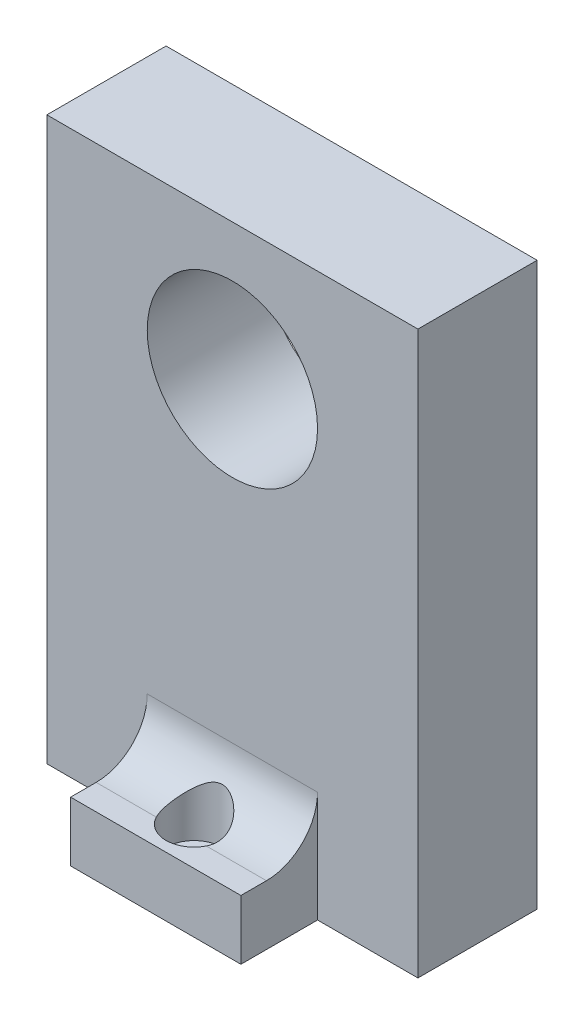
ISO-10303-21;
HEADER;
FILE_DESCRIPTION(('STEP AP214'),'2;1');
FILE_NAME('part.step','',(''),(''),'','','');
FILE_SCHEMA(('AUTOMOTIVE_DESIGN { 1 0 10303 214 1 1 1 1 }'));
ENDSEC;
DATA;
#1=APPLICATION_CONTEXT('core data for automotive mechanical design processes');
#2=APPLICATION_PROTOCOL_DEFINITION('international standard','automotive_design',2000,#1);
#3=PRODUCT_CONTEXT('',#1,'mechanical');
#4=PRODUCT('Part','Part','',(#3));
#5=PRODUCT_RELATED_PRODUCT_CATEGORY('part','',(#4));
#6=PRODUCT_DEFINITION_FORMATION('','',#4);
#7=PRODUCT_DEFINITION_CONTEXT('part definition',#1,'design');
#8=PRODUCT_DEFINITION('design','',#6,#7);
#9=PRODUCT_DEFINITION_SHAPE('','',#8);
#10=(LENGTH_UNIT() NAMED_UNIT(*) SI_UNIT(.MILLI.,.METRE.));
#11=(NAMED_UNIT(*) PLANE_ANGLE_UNIT() SI_UNIT($,.RADIAN.));
#12=(NAMED_UNIT(*) SI_UNIT($,.STERADIAN.) SOLID_ANGLE_UNIT());
#13=UNCERTAINTY_MEASURE_WITH_UNIT(LENGTH_MEASURE(1.E-05),#10,'distance_accuracy_value','');
#14=(GEOMETRIC_REPRESENTATION_CONTEXT(3) GLOBAL_UNCERTAINTY_ASSIGNED_CONTEXT((#13)) GLOBAL_UNIT_ASSIGNED_CONTEXT((#10,
#11,#12)) REPRESENTATION_CONTEXT('',''));
#15=CARTESIAN_POINT('',(0.,0.,0.));
#16=DIRECTION('',(0.,0.,1.));
#17=DIRECTION('',(1.,0.,0.));
#18=AXIS2_PLACEMENT_3D('',#15,#16,#17);
#19=CARTESIAN_POINT('',(10.89386886,0.,-2.25));
#20=DIRECTION('',(0.,1.,0.));
#21=DIRECTION('',(-1.,0.,0.));
#22=AXIS2_PLACEMENT_3D('',#19,#20,#21);
#23=CYLINDRICAL_SURFACE('',#22,1.);
#24=CARTESIAN_POINT('',(10.89386886,0.,-2.25));
#25=DIRECTION('',(0.,1.,0.));
#26=DIRECTION('',(-1.,0.,0.));
#27=AXIS2_PLACEMENT_3D('',#24,#25,#26);
#28=CIRCLE('',#27,1.);
#29=CARTESIAN_POINT('',(9.89386886,0.,-2.25));
#30=VERTEX_POINT('',#29);
#31=EDGE_CURVE('E177',#30,#30,#28,.T.);
#32=ORIENTED_EDGE('',*,*,#31,.F.);
#33=EDGE_LOOP('',(#32));
#34=FACE_BOUND('',#33,.T.);
#35=CARTESIAN_POINT('',(10.89386886,1.5,-2.25));
#36=DIRECTION('',(0.,1.,0.));
#37=DIRECTION('',(-1.,0.,0.));
#38=AXIS2_PLACEMENT_3D('',#35,#36,#37);
#39=CIRCLE('',#38,1.);
#40=CARTESIAN_POINT('',(9.89386886,1.5,-2.25));
#41=VERTEX_POINT('',#40);
#42=EDGE_CURVE('E251',#41,#41,#39,.F.);
#43=ORIENTED_EDGE('',*,*,#42,.F.);
#44=EDGE_LOOP('',(#43));
#45=FACE_BOUND('',#44,.T.);
#46=ADVANCED_FACE('F33',(#34,#45),#23,.F.);
#47=CARTESIAN_POINT('',(10.89386886,0.,9.25));
#48=DIRECTION('',(0.,1.,0.));
#49=DIRECTION('',(-1.,0.,0.));
#50=AXIS2_PLACEMENT_3D('',#47,#48,#49);
#51=CYLINDRICAL_SURFACE('',#50,1.);
#52=CARTESIAN_POINT('',(10.89386886,0.,9.25));
#53=DIRECTION('',(0.,1.,0.));
#54=DIRECTION('',(-1.,0.,0.));
#55=AXIS2_PLACEMENT_3D('',#52,#53,#54);
#56=CIRCLE('',#55,1.);
#57=CARTESIAN_POINT('',(9.89386886,0.,9.25));
#58=VERTEX_POINT('',#57);
#59=EDGE_CURVE('E255',#58,#58,#56,.T.);
#60=ORIENTED_EDGE('',*,*,#59,.F.);
#61=EDGE_LOOP('',(#60));
#62=FACE_BOUND('',#61,.T.);
#63=CARTESIAN_POINT('',(10.89386886,1.5,9.25));
#64=DIRECTION('',(0.,1.,0.));
#65=DIRECTION('',(-1.,0.,0.));
#66=AXIS2_PLACEMENT_3D('',#63,#64,#65);
#67=CIRCLE('',#66,1.);
#68=CARTESIAN_POINT('',(9.89386886,1.5,9.25));
#69=VERTEX_POINT('',#68);
#70=EDGE_CURVE('E248',#69,#69,#67,.F.);
#71=ORIENTED_EDGE('',*,*,#70,.F.);
#72=EDGE_LOOP('',(#71));
#73=FACE_BOUND('',#72,.T.);
#74=ADVANCED_FACE('F309',(#62,#73),#51,.F.);
#75=CARTESIAN_POINT('',(0.,0.,0.));
#76=DIRECTION('',(0.,0.,-1.));
#77=DIRECTION('',(-1.,0.,0.));
#78=AXIS2_PLACEMENT_3D('',#75,#76,#77);
#79=PLANE('',#78);
#80=CARTESIAN_POINT('',(10.89386886,25.,0.));
#81=DIRECTION('',(0.,0.,1.));
#82=DIRECTION('',(1.,0.,0.));
#83=AXIS2_PLACEMENT_3D('',#80,#81,#82);
#84=CIRCLE('',#83,5.);
#85=CARTESIAN_POINT('',(15.89386886,25.,0.));
#86=VERTEX_POINT('',#85);
#87=EDGE_CURVE('E209',#86,#86,#84,.T.);
#88=ORIENTED_EDGE('',*,*,#87,.T.);
#89=EDGE_LOOP('',(#88));
#90=FACE_BOUND('',#89,.T.);
#91=DIRECTION('',(-1.,0.,0.));
#92=VECTOR('',#91,1.);
#93=CARTESIAN_POINT('',(5.89386886,6.5,0.));
#94=LINE('',#93,#92);
#95=CARTESIAN_POINT('',(15.89386886,6.5,0.));
#96=VERTEX_POINT('',#95);
#97=CARTESIAN_POINT('',(5.89386886,6.5,0.));
#98=VERTEX_POINT('',#97);
#99=EDGE_CURVE('E263',#96,#98,#94,.T.);
#100=ORIENTED_EDGE('',*,*,#99,.T.);
#101=DIRECTION('',(0.,-1.,0.));
#102=VECTOR('',#101,1.);
#103=CARTESIAN_POINT('',(5.89386886,0.,0.));
#104=LINE('',#103,#102);
#105=CARTESIAN_POINT('',(5.89386886,0.,0.));
#106=VERTEX_POINT('',#105);
#107=EDGE_CURVE('E174',#98,#106,#104,.T.);
#108=ORIENTED_EDGE('',*,*,#107,.T.);
#109=DIRECTION('',(1.,0.,0.));
#110=VECTOR('',#109,1.);
#111=CARTESIAN_POINT('',(0.,0.,0.));
#112=LINE('',#111,#110);
#113=CARTESIAN_POINT('',(0.,0.,0.));
#114=VERTEX_POINT('',#113);
#115=EDGE_CURVE('E230',#114,#106,#112,.T.);
#116=ORIENTED_EDGE('',*,*,#115,.F.);
#117=DIRECTION('',(0.,-1.,0.));
#118=VECTOR('',#117,1.);
#119=CARTESIAN_POINT('',(0.,0.,0.));
#120=LINE('',#119,#118);
#121=CARTESIAN_POINT('',(0.,33.,0.));
#122=VERTEX_POINT('',#121);
#123=EDGE_CURVE('E212',#122,#114,#120,.T.);
#124=ORIENTED_EDGE('',*,*,#123,.F.);
#125=DIRECTION('',(-1.,0.,0.));
#126=VECTOR('',#125,1.);
#127=CARTESIAN_POINT('',(0.,33.,0.));
#128=LINE('',#127,#126);
#129=CARTESIAN_POINT('',(21.78773772,33.,0.));
#130=VERTEX_POINT('',#129);
#131=EDGE_CURVE('E219',#130,#122,#128,.T.);
#132=ORIENTED_EDGE('',*,*,#131,.F.);
#133=DIRECTION('',(0.,1.,0.));
#134=VECTOR('',#133,1.);
#135=CARTESIAN_POINT('',(21.78773772,0.,0.));
#136=LINE('',#135,#134);
#137=CARTESIAN_POINT('',(21.78773772,0.,0.));
#138=VERTEX_POINT('',#137);
#139=EDGE_CURVE('E233',#138,#130,#136,.T.);
#140=ORIENTED_EDGE('',*,*,#139,.F.);
#141=CARTESIAN_POINT('',(15.89386886,0.,0.));
#142=VERTEX_POINT('',#141);
#143=EDGE_CURVE('E229',#142,#138,#112,.T.);
#144=ORIENTED_EDGE('',*,*,#143,.F.);
#145=DIRECTION('',(0.,1.,0.));
#146=VECTOR('',#145,1.);
#147=CARTESIAN_POINT('',(15.89386886,0.,0.));
#148=LINE('',#147,#146);
#149=EDGE_CURVE('E164',#142,#96,#148,.T.);
#150=ORIENTED_EDGE('',*,*,#149,.T.);
#151=EDGE_LOOP('',(#100,#108,#116,#124,#132,#140,#144,#150));
#152=FACE_BOUND('',#151,.T.);
#153=ADVANCED_FACE('F306',(#90,#152),#79,.T.);
#154=CARTESIAN_POINT('',(0.,0.,7.));
#155=DIRECTION('',(0.,0.,-1.));
#156=DIRECTION('',(-1.,0.,0.));
#157=AXIS2_PLACEMENT_3D('',#154,#155,#156);
#158=PLANE('',#157);
#159=CARTESIAN_POINT('',(10.89386886,25.,7.));
#160=DIRECTION('',(0.,0.,1.));
#161=DIRECTION('',(1.,0.,0.));
#162=AXIS2_PLACEMENT_3D('',#159,#160,#161);
#163=CIRCLE('',#162,5.);
#164=CARTESIAN_POINT('',(15.89386886,25.,7.));
#165=VERTEX_POINT('',#164);
#166=EDGE_CURVE('E208',#165,#165,#163,.T.);
#167=ORIENTED_EDGE('',*,*,#166,.F.);
#168=EDGE_LOOP('',(#167));
#169=FACE_BOUND('',#168,.T.);
#170=DIRECTION('',(0.,-1.,0.));
#171=VECTOR('',#170,1.);
#172=CARTESIAN_POINT('',(5.89386886,0.,7.));
#173=LINE('',#172,#171);
#174=CARTESIAN_POINT('',(5.89386886,6.5,7.));
#175=VERTEX_POINT('',#174);
#176=CARTESIAN_POINT('',(5.89386886,0.,7.));
#177=VERTEX_POINT('',#176);
#178=EDGE_CURVE('E153',#175,#177,#173,.T.);
#179=ORIENTED_EDGE('',*,*,#178,.F.);
#180=DIRECTION('',(-1.,0.,0.));
#181=VECTOR('',#180,1.);
#182=CARTESIAN_POINT('',(15.89386886,6.5,7.));
#183=LINE('',#182,#181);
#184=CARTESIAN_POINT('',(15.89386886,6.5,7.));
#185=VERTEX_POINT('',#184);
#186=EDGE_CURVE('E260',#175,#185,#183,.F.);
#187=ORIENTED_EDGE('',*,*,#186,.T.);
#188=DIRECTION('',(0.,1.,0.));
#189=VECTOR('',#188,1.);
#190=CARTESIAN_POINT('',(15.89386886,0.,7.));
#191=LINE('',#190,#189);
#192=CARTESIAN_POINT('',(15.89386886,0.,7.));
#193=VERTEX_POINT('',#192);
#194=EDGE_CURVE('E187',#193,#185,#191,.T.);
#195=ORIENTED_EDGE('',*,*,#194,.F.);
#196=DIRECTION('',(1.,0.,0.));
#197=VECTOR('',#196,1.);
#198=CARTESIAN_POINT('',(0.,0.,7.));
#199=LINE('',#198,#197);
#200=CARTESIAN_POINT('',(21.78773772,0.,7.));
#201=VERTEX_POINT('',#200);
#202=EDGE_CURVE('E218',#193,#201,#199,.T.);
#203=ORIENTED_EDGE('',*,*,#202,.T.);
#204=DIRECTION('',(0.,1.,0.));
#205=VECTOR('',#204,1.);
#206=CARTESIAN_POINT('',(21.78773772,0.,7.));
#207=LINE('',#206,#205);
#208=CARTESIAN_POINT('',(21.78773772,33.,7.));
#209=VERTEX_POINT('',#208);
#210=EDGE_CURVE('E222',#201,#209,#207,.T.);
#211=ORIENTED_EDGE('',*,*,#210,.T.);
#212=DIRECTION('',(-1.,0.,0.));
#213=VECTOR('',#212,1.);
#214=CARTESIAN_POINT('',(0.,33.,7.));
#215=LINE('',#214,#213);
#216=CARTESIAN_POINT('',(0.,33.,7.));
#217=VERTEX_POINT('',#216);
#218=EDGE_CURVE('E224',#209,#217,#215,.T.);
#219=ORIENTED_EDGE('',*,*,#218,.T.);
#220=DIRECTION('',(0.,-1.,0.));
#221=VECTOR('',#220,1.);
#222=CARTESIAN_POINT('',(0.,0.,7.));
#223=LINE('',#222,#221);
#224=CARTESIAN_POINT('',(0.,0.,7.));
#225=VERTEX_POINT('',#224);
#226=EDGE_CURVE('E215',#217,#225,#223,.T.);
#227=ORIENTED_EDGE('',*,*,#226,.T.);
#228=EDGE_CURVE('E220',#225,#177,#199,.T.);
#229=ORIENTED_EDGE('',*,*,#228,.T.);
#230=EDGE_LOOP('',(#179,#187,#195,#203,#211,#219,#227,#229));
#231=FACE_BOUND('',#230,.T.);
#232=ADVANCED_FACE('F292',(#169,#231),#158,.F.);
#233=CARTESIAN_POINT('',(0.,0.,7.));
#234=DIRECTION('',(1.,0.,0.));
#235=DIRECTION('',(0.,0.,-1.));
#236=AXIS2_PLACEMENT_3D('',#233,#234,#235);
#237=PLANE('',#236);
#238=ORIENTED_EDGE('',*,*,#123,.T.);
#239=DIRECTION('',(0.,0.,-1.));
#240=VECTOR('',#239,1.);
#241=CARTESIAN_POINT('',(0.,0.,7.));
#242=LINE('',#241,#240);
#243=EDGE_CURVE('E244',#225,#114,#242,.T.);
#244=ORIENTED_EDGE('',*,*,#243,.F.);
#245=ORIENTED_EDGE('',*,*,#226,.F.);
#246=DIRECTION('',(0.,0.,-1.));
#247=VECTOR('',#246,1.);
#248=CARTESIAN_POINT('',(0.,33.,7.));
#249=LINE('',#248,#247);
#250=EDGE_CURVE('E226',#217,#122,#249,.T.);
#251=ORIENTED_EDGE('',*,*,#250,.T.);
#252=EDGE_LOOP('',(#238,#244,#245,#251));
#253=FACE_BOUND('',#252,.T.);
#254=ADVANCED_FACE('F288',(#253),#237,.F.);
#255=CARTESIAN_POINT('',(0.,0.,7.));
#256=DIRECTION('',(0.,1.,0.));
#257=DIRECTION('',(0.,0.,1.));
#258=AXIS2_PLACEMENT_3D('',#255,#256,#257);
#259=PLANE('',#258);
#260=ORIENTED_EDGE('',*,*,#31,.T.);
#261=EDGE_LOOP('',(#260));
#262=FACE_BOUND('',#261,.T.);
#263=ORIENTED_EDGE('',*,*,#59,.T.);
#264=EDGE_LOOP('',(#263));
#265=FACE_BOUND('',#264,.T.);
#266=ORIENTED_EDGE('',*,*,#115,.T.);
#267=DIRECTION('',(0.,0.,1.));
#268=VECTOR('',#267,1.);
#269=CARTESIAN_POINT('',(5.89386886,0.,-4.5));
#270=LINE('',#269,#268);
#271=CARTESIAN_POINT('',(5.89386886,0.,-4.5));
#272=VERTEX_POINT('',#271);
#273=EDGE_CURVE('E173',#272,#106,#270,.T.);
#274=ORIENTED_EDGE('',*,*,#273,.F.);
#275=DIRECTION('',(1.,0.,0.));
#276=VECTOR('',#275,1.);
#277=CARTESIAN_POINT('',(5.89386886,0.,-4.5));
#278=LINE('',#277,#276);
#279=CARTESIAN_POINT('',(15.89386886,0.,-4.5));
#280=VERTEX_POINT('',#279);
#281=EDGE_CURVE('E163',#272,#280,#278,.T.);
#282=ORIENTED_EDGE('',*,*,#281,.T.);
#283=DIRECTION('',(0.,0.,1.));
#284=VECTOR('',#283,1.);
#285=CARTESIAN_POINT('',(15.89386886,0.,-4.5));
#286=LINE('',#285,#284);
#287=EDGE_CURVE('E180',#280,#142,#286,.T.);
#288=ORIENTED_EDGE('',*,*,#287,.T.);
#289=ORIENTED_EDGE('',*,*,#143,.T.);
#290=DIRECTION('',(0.,0.,-1.));
#291=VECTOR('',#290,1.);
#292=CARTESIAN_POINT('',(21.78773772,0.,7.));
#293=LINE('',#292,#291);
#294=EDGE_CURVE('E241',#201,#138,#293,.T.);
#295=ORIENTED_EDGE('',*,*,#294,.F.);
#296=ORIENTED_EDGE('',*,*,#202,.F.);
#297=DIRECTION('',(0.,0.,-1.));
#298=VECTOR('',#297,1.);
#299=CARTESIAN_POINT('',(15.89386886,0.,11.5));
#300=LINE('',#299,#298);
#301=CARTESIAN_POINT('',(15.89386886,0.,11.5));
#302=VERTEX_POINT('',#301);
#303=EDGE_CURVE('E202',#302,#193,#300,.T.);
#304=ORIENTED_EDGE('',*,*,#303,.F.);
#305=DIRECTION('',(1.,0.,0.));
#306=VECTOR('',#305,1.);
#307=CARTESIAN_POINT('',(5.89386886,0.,11.5));
#308=LINE('',#307,#306);
#309=CARTESIAN_POINT('',(5.89386886,0.,11.5));
#310=VERTEX_POINT('',#309);
#311=EDGE_CURVE('E186',#310,#302,#308,.T.);
#312=ORIENTED_EDGE('',*,*,#311,.F.);
#313=DIRECTION('',(0.,0.,-1.));
#314=VECTOR('',#313,1.);
#315=CARTESIAN_POINT('',(5.89386886,0.,11.5));
#316=LINE('',#315,#314);
#317=EDGE_CURVE('E205',#310,#177,#316,.T.);
#318=ORIENTED_EDGE('',*,*,#317,.T.);
#319=ORIENTED_EDGE('',*,*,#228,.F.);
#320=ORIENTED_EDGE('',*,*,#243,.T.);
#321=EDGE_LOOP('',(#266,#274,#282,#288,#289,#295,#296,#304,#312,#318,#319,#320));
#322=FACE_BOUND('',#321,.T.);
#323=ADVANCED_FACE('F291',(#262,#265,#322),#259,.F.);
#324=CARTESIAN_POINT('',(21.78773772,0.,7.));
#325=DIRECTION('',(-1.,0.,0.));
#326=DIRECTION('',(0.,0.,1.));
#327=AXIS2_PLACEMENT_3D('',#324,#325,#326);
#328=PLANE('',#327);
#329=ORIENTED_EDGE('',*,*,#139,.T.);
#330=DIRECTION('',(0.,0.,-1.));
#331=VECTOR('',#330,1.);
#332=CARTESIAN_POINT('',(21.78773772,33.,7.));
#333=LINE('',#332,#331);
#334=EDGE_CURVE('E238',#209,#130,#333,.T.);
#335=ORIENTED_EDGE('',*,*,#334,.F.);
#336=ORIENTED_EDGE('',*,*,#210,.F.);
#337=ORIENTED_EDGE('',*,*,#294,.T.);
#338=EDGE_LOOP('',(#329,#335,#336,#337));
#339=FACE_BOUND('',#338,.T.);
#340=ADVANCED_FACE('F296',(#339),#328,.F.);
#341=CARTESIAN_POINT('',(0.,33.,7.));
#342=DIRECTION('',(0.,-1.,0.));
#343=DIRECTION('',(0.,0.,-1.));
#344=AXIS2_PLACEMENT_3D('',#341,#342,#343);
#345=PLANE('',#344);
#346=ORIENTED_EDGE('',*,*,#131,.T.);
#347=ORIENTED_EDGE('',*,*,#250,.F.);
#348=ORIENTED_EDGE('',*,*,#218,.F.);
#349=ORIENTED_EDGE('',*,*,#334,.T.);
#350=EDGE_LOOP('',(#346,#347,#348,#349));
#351=FACE_BOUND('',#350,.T.);
#352=ADVANCED_FACE('F300',(#351),#345,.F.);
#353=CARTESIAN_POINT('',(10.89386886,25.,0.));
#354=DIRECTION('',(0.,0.,1.));
#355=DIRECTION('',(1.,0.,0.));
#356=AXIS2_PLACEMENT_3D('',#353,#354,#355);
#357=CYLINDRICAL_SURFACE('',#356,5.);
#358=ORIENTED_EDGE('',*,*,#87,.F.);
#359=EDGE_LOOP('',(#358));
#360=FACE_BOUND('',#359,.T.);
#361=ORIENTED_EDGE('',*,*,#166,.T.);
#362=EDGE_LOOP('',(#361));
#363=FACE_BOUND('',#362,.T.);
#364=ADVANCED_FACE('F304',(#360,#363),#357,.F.);
#365=CARTESIAN_POINT('',(5.89386886,0.,11.5));
#366=DIRECTION('',(1.,0.,0.));
#367=DIRECTION('',(0.,0.,-1.));
#368=AXIS2_PLACEMENT_3D('',#365,#366,#367);
#369=PLANE('',#368);
#370=ORIENTED_EDGE('',*,*,#178,.T.);
#371=ORIENTED_EDGE('',*,*,#317,.F.);
#372=DIRECTION('',(0.,-1.,0.));
#373=VECTOR('',#372,1.);
#374=CARTESIAN_POINT('',(5.89386886,0.,11.5));
#375=LINE('',#374,#373);
#376=CARTESIAN_POINT('',(5.89386886,3.5,11.5));
#377=VERTEX_POINT('',#376);
#378=EDGE_CURVE('E183',#377,#310,#375,.T.);
#379=ORIENTED_EDGE('',*,*,#378,.F.);
#380=DIRECTION('',(0.,0.,-1.));
#381=VECTOR('',#380,1.);
#382=CARTESIAN_POINT('',(5.89386886,3.5,11.5));
#383=LINE('',#382,#381);
#384=CARTESIAN_POINT('',(5.89386886,3.5,10.));
#385=VERTEX_POINT('',#384);
#386=EDGE_CURVE('E193',#377,#385,#383,.T.);
#387=ORIENTED_EDGE('',*,*,#386,.T.);
#388=CARTESIAN_POINT('',(5.89386886,6.5,10.));
#389=DIRECTION('',(1.,0.,0.));
#390=DIRECTION('',(0.,0.,-1.));
#391=AXIS2_PLACEMENT_3D('',#388,#389,#390);
#392=CIRCLE('',#391,3.);
#393=EDGE_CURVE('E276',#385,#175,#392,.T.);
#394=ORIENTED_EDGE('',*,*,#393,.T.);
#395=EDGE_LOOP('',(#370,#371,#379,#387,#394));
#396=FACE_BOUND('',#395,.T.);
#397=ADVANCED_FACE('F316',(#396),#369,.F.);
#398=CARTESIAN_POINT('',(15.89386886,0.,11.5));
#399=DIRECTION('',(-1.,0.,0.));
#400=DIRECTION('',(0.,0.,1.));
#401=AXIS2_PLACEMENT_3D('',#398,#399,#400);
#402=PLANE('',#401);
#403=ORIENTED_EDGE('',*,*,#194,.T.);
#404=CARTESIAN_POINT('',(15.89386886,6.5,10.));
#405=DIRECTION('',(-1.,0.,0.));
#406=DIRECTION('',(0.,0.,1.));
#407=AXIS2_PLACEMENT_3D('',#404,#405,#406);
#408=CIRCLE('',#407,3.);
#409=CARTESIAN_POINT('',(15.89386886,3.5,10.));
#410=VERTEX_POINT('',#409);
#411=EDGE_CURVE('E373',#185,#410,#408,.T.);
#412=ORIENTED_EDGE('',*,*,#411,.T.);
#413=DIRECTION('',(0.,0.,-1.));
#414=VECTOR('',#413,1.);
#415=CARTESIAN_POINT('',(15.89386886,3.5,11.5));
#416=LINE('',#415,#414);
#417=CARTESIAN_POINT('',(15.89386886,3.5,11.5));
#418=VERTEX_POINT('',#417);
#419=EDGE_CURVE('E199',#418,#410,#416,.T.);
#420=ORIENTED_EDGE('',*,*,#419,.F.);
#421=DIRECTION('',(0.,1.,0.));
#422=VECTOR('',#421,1.);
#423=CARTESIAN_POINT('',(15.89386886,0.,11.5));
#424=LINE('',#423,#422);
#425=EDGE_CURVE('E189',#302,#418,#424,.T.);
#426=ORIENTED_EDGE('',*,*,#425,.F.);
#427=ORIENTED_EDGE('',*,*,#303,.T.);
#428=EDGE_LOOP('',(#403,#412,#420,#426,#427));
#429=FACE_BOUND('',#428,.T.);
#430=ADVANCED_FACE('F320',(#429),#402,.F.);
#431=CARTESIAN_POINT('',(15.89386886,3.5,11.5));
#432=DIRECTION('',(0.,-1.,0.));
#433=DIRECTION('',(1.,0.,0.));
#434=AXIS2_PLACEMENT_3D('',#431,#432,#433);
#435=PLANE('',#434);
#436=ORIENTED_EDGE('',*,*,#419,.T.);
#437=DIRECTION('',(-1.,0.,0.));
#438=VECTOR('',#437,1.);
#439=CARTESIAN_POINT('',(5.89386886,3.5,10.));
#440=LINE('',#439,#438);
#441=CARTESIAN_POINT('',(12.3635627056699,3.5,10.));
#442=VERTEX_POINT('',#441);
#443=EDGE_CURVE('E257',#410,#442,#440,.T.);
#444=ORIENTED_EDGE('',*,*,#443,.T.);
#445=CARTESIAN_POINT('',(10.89386886,3.5,9.25));
#446=DIRECTION('',(0.,1.,0.));
#447=DIRECTION('',(-1.,0.,0.));
#448=AXIS2_PLACEMENT_3D('',#445,#446,#447);
#449=CIRCLE('',#448,1.65);
#450=CARTESIAN_POINT('',(9.4241750143301,3.5,10.));
#451=VERTEX_POINT('',#450);
#452=EDGE_CURVE('E394',#451,#442,#449,.T.);
#453=ORIENTED_EDGE('',*,*,#452,.F.);
#454=DIRECTION('',(-1.,0.,0.));
#455=VECTOR('',#454,1.);
#456=CARTESIAN_POINT('',(5.89386886,3.5,10.));
#457=LINE('',#456,#455);
#458=EDGE_CURVE('E247',#451,#385,#457,.T.);
#459=ORIENTED_EDGE('',*,*,#458,.T.);
#460=ORIENTED_EDGE('',*,*,#386,.F.);
#461=DIRECTION('',(-1.,0.,0.));
#462=VECTOR('',#461,1.);
#463=CARTESIAN_POINT('',(15.89386886,3.5,11.5));
#464=LINE('',#463,#462);
#465=EDGE_CURVE('E191',#418,#377,#464,.T.);
#466=ORIENTED_EDGE('',*,*,#465,.F.);
#467=EDGE_LOOP('',(#436,#444,#453,#459,#460,#466));
#468=FACE_BOUND('',#467,.T.);
#469=ADVANCED_FACE('F324',(#468),#435,.F.);
#470=CARTESIAN_POINT('',(0.,0.,11.5));
#471=DIRECTION('',(0.,0.,1.));
#472=DIRECTION('',(1.,0.,0.));
#473=AXIS2_PLACEMENT_3D('',#470,#471,#472);
#474=PLANE('',#473);
#475=ORIENTED_EDGE('',*,*,#378,.T.);
#476=ORIENTED_EDGE('',*,*,#311,.T.);
#477=ORIENTED_EDGE('',*,*,#425,.T.);
#478=ORIENTED_EDGE('',*,*,#465,.T.);
#479=EDGE_LOOP('',(#475,#476,#477,#478));
#480=FACE_BOUND('',#479,.T.);
#481=ADVANCED_FACE('F328',(#480),#474,.T.);
#482=CARTESIAN_POINT('',(5.89386886,0.,-4.5));
#483=DIRECTION('',(-1.,0.,0.));
#484=DIRECTION('',(0.,0.,1.));
#485=AXIS2_PLACEMENT_3D('',#482,#483,#484);
#486=PLANE('',#485);
#487=ORIENTED_EDGE('',*,*,#107,.F.);
#488=CARTESIAN_POINT('',(5.89386886,6.5,-3.));
#489=DIRECTION('',(-1.,0.,0.));
#490=DIRECTION('',(0.,0.,1.));
#491=AXIS2_PLACEMENT_3D('',#488,#489,#490);
#492=CIRCLE('',#491,3.);
#493=CARTESIAN_POINT('',(5.89386886,3.5,-3.));
#494=VERTEX_POINT('',#493);
#495=EDGE_CURVE('E49',#98,#494,#492,.F.);
#496=ORIENTED_EDGE('',*,*,#495,.T.);
#497=DIRECTION('',(0.,0.,1.));
#498=VECTOR('',#497,1.);
#499=CARTESIAN_POINT('',(5.89386886,3.5,-4.5));
#500=LINE('',#499,#498);
#501=CARTESIAN_POINT('',(5.89386886,3.5,-4.5));
#502=VERTEX_POINT('',#501);
#503=EDGE_CURVE('E146',#502,#494,#500,.T.);
#504=ORIENTED_EDGE('',*,*,#503,.F.);
#505=DIRECTION('',(0.,-1.,0.));
#506=VECTOR('',#505,1.);
#507=CARTESIAN_POINT('',(5.89386886,0.,-4.5));
#508=LINE('',#507,#506);
#509=EDGE_CURVE('E149',#502,#272,#508,.T.);
#510=ORIENTED_EDGE('',*,*,#509,.T.);
#511=ORIENTED_EDGE('',*,*,#273,.T.);
#512=EDGE_LOOP('',(#487,#496,#504,#510,#511));
#513=FACE_BOUND('',#512,.T.);
#514=ADVANCED_FACE('F148',(#513),#486,.T.);
#515=CARTESIAN_POINT('',(15.89386886,3.5,-4.5));
#516=DIRECTION('',(0.,1.,0.));
#517=DIRECTION('',(-1.,0.,0.));
#518=AXIS2_PLACEMENT_3D('',#515,#516,#517);
#519=PLANE('',#518);
#520=ORIENTED_EDGE('',*,*,#503,.T.);
#521=DIRECTION('',(-1.,0.,0.));
#522=VECTOR('',#521,1.);
#523=CARTESIAN_POINT('',(15.89386886,3.5,-3.));
#524=LINE('',#523,#522);
#525=CARTESIAN_POINT('',(9.42417501433009,3.5,-3.));
#526=VERTEX_POINT('',#525);
#527=EDGE_CURVE('E267',#494,#526,#524,.F.);
#528=ORIENTED_EDGE('',*,*,#527,.T.);
#529=CARTESIAN_POINT('',(10.89386886,3.5,-2.25));
#530=DIRECTION('',(0.,1.,0.));
#531=DIRECTION('',(-1.,0.,0.));
#532=AXIS2_PLACEMENT_3D('',#529,#530,#531);
#533=CIRCLE('',#532,1.65);
#534=CARTESIAN_POINT('',(12.3635627056699,3.5,-3.));
#535=VERTEX_POINT('',#534);
#536=EDGE_CURVE('E399',#535,#526,#533,.T.);
#537=ORIENTED_EDGE('',*,*,#536,.F.);
#538=DIRECTION('',(-1.,0.,0.));
#539=VECTOR('',#538,1.);
#540=CARTESIAN_POINT('',(15.89386886,3.5,-3.));
#541=LINE('',#540,#539);
#542=CARTESIAN_POINT('',(15.89386886,3.5,-3.));
#543=VERTEX_POINT('',#542);
#544=EDGE_CURVE('E57',#535,#543,#541,.F.);
#545=ORIENTED_EDGE('',*,*,#544,.T.);
#546=DIRECTION('',(0.,0.,1.));
#547=VECTOR('',#546,1.);
#548=CARTESIAN_POINT('',(15.89386886,3.5,-4.5));
#549=LINE('',#548,#547);
#550=CARTESIAN_POINT('',(15.89386886,3.5,-4.5));
#551=VERTEX_POINT('',#550);
#552=EDGE_CURVE('E154',#551,#543,#549,.T.);
#553=ORIENTED_EDGE('',*,*,#552,.F.);
#554=DIRECTION('',(-1.,0.,0.));
#555=VECTOR('',#554,1.);
#556=CARTESIAN_POINT('',(15.89386886,3.5,-4.5));
#557=LINE('',#556,#555);
#558=EDGE_CURVE('E160',#551,#502,#557,.T.);
#559=ORIENTED_EDGE('',*,*,#558,.T.);
#560=EDGE_LOOP('',(#520,#528,#537,#545,#553,#559));
#561=FACE_BOUND('',#560,.T.);
#562=ADVANCED_FACE('F166',(#561),#519,.T.);
#563=CARTESIAN_POINT('',(15.89386886,0.,-4.5));
#564=DIRECTION('',(1.,0.,0.));
#565=DIRECTION('',(0.,0.,-1.));
#566=AXIS2_PLACEMENT_3D('',#563,#564,#565);
#567=PLANE('',#566);
#568=ORIENTED_EDGE('',*,*,#149,.F.);
#569=ORIENTED_EDGE('',*,*,#287,.F.);
#570=DIRECTION('',(0.,1.,0.));
#571=VECTOR('',#570,1.);
#572=CARTESIAN_POINT('',(15.89386886,0.,-4.5));
#573=LINE('',#572,#571);
#574=EDGE_CURVE('E167',#280,#551,#573,.T.);
#575=ORIENTED_EDGE('',*,*,#574,.T.);
#576=ORIENTED_EDGE('',*,*,#552,.T.);
#577=CARTESIAN_POINT('',(15.89386886,6.5,-3.));
#578=DIRECTION('',(1.,0.,0.));
#579=DIRECTION('',(0.,0.,-1.));
#580=AXIS2_PLACEMENT_3D('',#577,#578,#579);
#581=CIRCLE('',#580,3.);
#582=EDGE_CURVE('E11',#543,#96,#581,.F.);
#583=ORIENTED_EDGE('',*,*,#582,.T.);
#584=EDGE_LOOP('',(#568,#569,#575,#576,#583));
#585=FACE_BOUND('',#584,.T.);
#586=ADVANCED_FACE('F337',(#585),#567,.T.);
#587=CARTESIAN_POINT('',(0.,0.,-4.5));
#588=DIRECTION('',(0.,0.,-1.));
#589=DIRECTION('',(1.,0.,0.));
#590=AXIS2_PLACEMENT_3D('',#587,#588,#589);
#591=PLANE('',#590);
#592=ORIENTED_EDGE('',*,*,#509,.F.);
#593=ORIENTED_EDGE('',*,*,#558,.F.);
#594=ORIENTED_EDGE('',*,*,#574,.F.);
#595=ORIENTED_EDGE('',*,*,#281,.F.);
#596=EDGE_LOOP('',(#592,#593,#594,#595));
#597=FACE_BOUND('',#596,.T.);
#598=ADVANCED_FACE('F158',(#597),#591,.T.);
#599=CARTESIAN_POINT('',(10.89386886,1.5,9.25));
#600=DIRECTION('',(0.,1.,0.));
#601=DIRECTION('',(-1.,0.,0.));
#602=AXIS2_PLACEMENT_3D('',#599,#600,#601);
#603=PLANE('',#602);
#604=CARTESIAN_POINT('',(10.89386886,1.5,9.25));
#605=DIRECTION('',(0.,1.,0.));
#606=DIRECTION('',(-1.,0.,0.));
#607=AXIS2_PLACEMENT_3D('',#604,#605,#606);
#608=CIRCLE('',#607,1.65);
#609=CARTESIAN_POINT('',(9.24386886,1.5,9.25));
#610=VERTEX_POINT('',#609);
#611=EDGE_CURVE('E396',#610,#610,#608,.T.);
#612=ORIENTED_EDGE('',*,*,#611,.T.);
#613=EDGE_LOOP('',(#612));
#614=FACE_BOUND('',#613,.T.);
#615=ORIENTED_EDGE('',*,*,#70,.T.);
#616=EDGE_LOOP('',(#615));
#617=FACE_BOUND('',#616,.T.);
#618=ADVANCED_FACE('F343',(#614,#617),#603,.T.);
#619=CARTESIAN_POINT('',(10.89386886,1.5,9.25));
#620=DIRECTION('',(0.,1.,0.));
#621=DIRECTION('',(-1.,0.,0.));
#622=AXIS2_PLACEMENT_3D('',#619,#620,#621);
#623=CYLINDRICAL_SURFACE('',#622,1.65);
#624=ORIENTED_EDGE('',*,*,#611,.F.);
#625=EDGE_LOOP('',(#624));
#626=FACE_BOUND('',#625,.T.);
#627=ORIENTED_EDGE('',*,*,#452,.T.);
#628=CARTESIAN_POINT('',(12.3635627056699,3.5,10.));
#629=CARTESIAN_POINT('',(12.3825845269807,3.49999449173433,9.96273879376025));
#630=CARTESIAN_POINT('',(12.4001791900371,3.50069409913137,9.92474637277603));
#631=CARTESIAN_POINT('',(12.4324185890001,3.50362687224929,9.84758503854713));
#632=CARTESIAN_POINT('',(12.4470631407488,3.50586013366878,9.80841605203166));
#633=CARTESIAN_POINT('',(12.4732666413733,3.51197478363725,9.72930596518014));
#634=CARTESIAN_POINT('',(12.484834327768,3.51585142230257,9.68936740426028));
#635=CARTESIAN_POINT('',(12.5048883236821,3.52532104578807,9.60893861371755));
#636=CARTESIAN_POINT('',(12.5133748646112,3.53091390165331,9.56844842576177));
#637=CARTESIAN_POINT('',(12.534190428537,3.55035320280804,9.44653210641327));
#638=CARTESIAN_POINT('',(12.5418712884222,3.566859464798,9.36467273770871));
#639=CARTESIAN_POINT('',(12.5451832786665,3.60674161946889,9.20247148468431));
#640=CARTESIAN_POINT('',(12.540813029424,3.63011829839612,9.12212977516502));
#641=CARTESIAN_POINT('',(12.5208317007207,3.68340952702356,8.96370307459691));
#642=CARTESIAN_POINT('',(12.5050450780484,3.71342103203813,8.88567337747243));
#643=CARTESIAN_POINT('',(12.4632984637008,3.77864220769237,8.73469794147465));
#644=CARTESIAN_POINT('',(12.437333437617,3.81385444532155,8.66175473952926));
#645=CARTESIAN_POINT('',(12.3722584751623,3.8933820867451,8.51215700988723));
#646=CARTESIAN_POINT('',(12.3318241233762,3.93828261607908,8.43639299390548));
#647=CARTESIAN_POINT('',(12.2408768924758,4.03129932518167,8.29330209836379));
#648=CARTESIAN_POINT('',(12.1903519695444,4.07941930150566,8.2259854592114));
#649=CARTESIAN_POINT('',(12.0696279439894,4.18622085895939,8.08808620699306));
#650=CARTESIAN_POINT('',(11.9975138151553,4.2451520114999,8.01937050980195));
#651=CARTESIAN_POINT('',(11.8409444014404,4.36063494716029,7.89518070201917));
#652=CARTESIAN_POINT('',(11.7564973231893,4.41718828055515,7.83969785013327));
#653=CARTESIAN_POINT('',(11.6069353581586,4.50324610813865,7.7605576361529));
#654=CARTESIAN_POINT('',(11.5455406460724,4.53524488423747,7.73258348348894));
#655=CARTESIAN_POINT('',(11.4172807460991,4.59309722009844,7.68372093755384));
#656=CARTESIAN_POINT('',(11.3504271172064,4.61896333397658,7.66281803067289));
#657=CARTESIAN_POINT('',(11.2256247525265,4.65708926740468,7.63269041213654));
#658=CARTESIAN_POINT('',(11.1685666283673,4.67103523354256,7.6219666535273));
#659=CARTESIAN_POINT('',(11.0523189575099,4.69120886398422,7.60658367409236));
#660=CARTESIAN_POINT('',(10.9931325634708,4.6974474969374,7.60191583434273));
#661=CARTESIAN_POINT('',(10.8741014702536,4.70127597392474,7.59904182595459));
#662=CARTESIAN_POINT('',(10.8142551975779,4.69883566696001,7.60085818377103));
#663=CARTESIAN_POINT('',(10.6960160251985,4.68563614691309,7.61082729842714));
#664=CARTESIAN_POINT('',(10.6376248792972,4.67486735319616,7.61898735276384));
#665=CARTESIAN_POINT('',(10.5085299511536,4.64271469037921,7.64394428330527));
#666=CARTESIAN_POINT('',(10.4386865624743,4.61926811885801,7.66246210374864));
#667=CARTESIAN_POINT('',(10.3045463439142,4.5649778087044,7.70720088057564));
#668=CARTESIAN_POINT('',(10.2402651249203,4.53411411402336,7.73344266213012));
#669=CARTESIAN_POINT('',(10.0870961224746,4.4517078806749,7.80709223985987));
#670=CARTESIAN_POINT('',(10.0016349803977,4.39745555226516,7.85856478012504));
#671=CARTESIAN_POINT('',(9.84258640505424,4.28556202214346,7.97446235464478));
#672=CARTESIAN_POINT('',(9.76901498903401,4.22791638934765,8.03890460307472));
#673=CARTESIAN_POINT('',(9.63195735600273,4.11161520978049,8.18220110232375));
#674=CARTESIAN_POINT('',(9.56884472410949,4.05298206481513,8.26143320408278));
#675=CARTESIAN_POINT('',(9.45713827163401,3.94018296555759,8.432269218621));
#676=CARTESIAN_POINT('',(9.4085214165855,3.8860100240436,8.52385316370659));
#677=CARTESIAN_POINT('',(9.33633608493533,3.79539410450124,8.69891770454339));
#678=CARTESIAN_POINT('',(9.30971486665308,3.75756383792788,8.7804164881202));
#679=CARTESIAN_POINT('',(9.26920129818046,3.68856932407086,8.94921720136707));
#680=CARTESIAN_POINT('',(9.25529878693223,3.65739977078603,9.03651443869915));
#681=CARTESIAN_POINT('',(9.24178635813708,3.60293314090157,9.21528019450145));
#682=CARTESIAN_POINT('',(9.24226886233702,3.57968794191248,9.30677191354627));
#683=CARTESIAN_POINT('',(9.2588596037463,3.54215307034491,9.49021231934074));
#684=CARTESIAN_POINT('',(9.27495985465563,3.52785882674803,9.58216074863931));
#685=CARTESIAN_POINT('',(9.31380593558606,3.51173297341374,9.72887909151668));
#686=CARTESIAN_POINT('',(9.33180250413426,3.5072386508382,9.78467245444877));
#687=CARTESIAN_POINT('',(9.37365373258831,3.5013656249565,9.89411541386713));
#688=CARTESIAN_POINT('',(9.39750159709631,3.49998332631895,9.94776741378204));
#689=CARTESIAN_POINT('',(9.4241750143301,3.5,10.));
#690=B_SPLINE_CURVE_WITH_KNOTS('',3,(#628,#629,#630,#631,#632,#633,#634,#635,#636,#637,#638,
#639,#640,#641,#642,#643,#644,#645,#646,#647,#648,#649,#650,#651,#652,#653,#654,#655,#656,#657,
#658,#659,#660,#661,#662,#663,#664,#665,#666,#667,#668,#669,#670,#671,#672,#673,#674,#675,#676,
#677,#678,#679,#680,#681,#682,#683,#684,#685,#686,#687,#688,#689),.UNSPECIFIED.,.F.,.F.,(4,2,2,
2,2,2,2,2,2,2,2,2,2,2,2,2,2,2,2,2,2,2,2,2,2,2,2,2,2,2,4),(0.,0.125473869980513,
0.250955570128442,0.376077034775569,0.50118910021414,0.751452329642349,1.00174421020028,
1.25596881557905,1.51031932367689,1.79997923163011,2.08998695810753,2.4358354282138,
2.78145480256306,3.00488567972399,3.22785514632755,3.40626267489542,3.58441601018167,
3.76318886122189,3.94216766919777,4.16879328859357,4.39603561714036,4.73492164731447,
5.07426046932884,5.42389195170435,5.77296485556278,6.05297317818539,6.33275760448735,
6.61433999234429,6.89577846593247,7.07178170430787,7.24758150099495),.UNSPECIFIED.);
#691=EDGE_CURVE('E269',#442,#451,#690,.T.);
#692=ORIENTED_EDGE('',*,*,#691,.T.);
#693=EDGE_LOOP('',(#627,#692));
#694=FACE_BOUND('',#693,.T.);
#695=ADVANCED_FACE('F278',(#626,#694),#623,.F.);
#696=CARTESIAN_POINT('',(10.89386886,1.5,-2.25));
#697=DIRECTION('',(0.,1.,0.));
#698=DIRECTION('',(-1.,0.,0.));
#699=AXIS2_PLACEMENT_3D('',#696,#697,#698);
#700=PLANE('',#699);
#701=CARTESIAN_POINT('',(10.89386886,1.5,-2.25));
#702=DIRECTION('',(0.,1.,0.));
#703=DIRECTION('',(-1.,0.,0.));
#704=AXIS2_PLACEMENT_3D('',#701,#702,#703);
#705=CIRCLE('',#704,1.65);
#706=CARTESIAN_POINT('',(9.24386886,1.5,-2.25));
#707=VERTEX_POINT('',#706);
#708=EDGE_CURVE('E252',#707,#707,#705,.T.);
#709=ORIENTED_EDGE('',*,*,#708,.T.);
#710=EDGE_LOOP('',(#709));
#711=FACE_BOUND('',#710,.T.);
#712=ORIENTED_EDGE('',*,*,#42,.T.);
#713=EDGE_LOOP('',(#712));
#714=FACE_BOUND('',#713,.T.);
#715=ADVANCED_FACE('F355',(#711,#714),#700,.T.);
#716=CARTESIAN_POINT('',(10.89386886,1.5,-2.25));
#717=DIRECTION('',(0.,1.,0.));
#718=DIRECTION('',(-1.,0.,0.));
#719=AXIS2_PLACEMENT_3D('',#716,#717,#718);
#720=CYLINDRICAL_SURFACE('',#719,1.65);
#721=ORIENTED_EDGE('',*,*,#708,.F.);
#722=EDGE_LOOP('',(#721));
#723=FACE_BOUND('',#722,.T.);
#724=ORIENTED_EDGE('',*,*,#536,.T.);
#725=CARTESIAN_POINT('',(9.42417501433009,3.5,-3.));
#726=CARTESIAN_POINT('',(9.40515319301934,3.49999449173433,-2.96273879376025));
#727=CARTESIAN_POINT('',(9.38755852996293,3.50069409913137,-2.92474637277603));
#728=CARTESIAN_POINT('',(9.35531913099986,3.50362687224929,-2.84758503854712));
#729=CARTESIAN_POINT('',(9.34067457925123,3.50586013366878,-2.80841605203166));
#730=CARTESIAN_POINT('',(9.31447107862672,3.51197478363725,-2.72930596518014));
#731=CARTESIAN_POINT('',(9.30290339223202,3.51585142230257,-2.68936740426029));
#732=CARTESIAN_POINT('',(9.28284939631795,3.52532104578807,-2.60893861371755));
#733=CARTESIAN_POINT('',(9.27436285538876,3.53091390165331,-2.56844842576178));
#734=CARTESIAN_POINT('',(9.25354729146306,3.55035320280804,-2.44653210641327));
#735=CARTESIAN_POINT('',(9.24586643157782,3.566859464798,-2.36467273770871));
#736=CARTESIAN_POINT('',(9.2425544413335,3.60674161946889,-2.20247148468431));
#737=CARTESIAN_POINT('',(9.24692469057604,3.63011829839612,-2.12212977516502));
#738=CARTESIAN_POINT('',(9.26690601927932,3.68340952702356,-1.96370307459691));
#739=CARTESIAN_POINT('',(9.28269264195156,3.71342103203813,-1.88567337747243));
#740=CARTESIAN_POINT('',(9.32443925629921,3.77864220769237,-1.73469794147464));
#741=CARTESIAN_POINT('',(9.35040428238302,3.81385444532156,-1.66175473952927));
#742=CARTESIAN_POINT('',(9.41547924483771,3.8933820867451,-1.51215700988723));
#743=CARTESIAN_POINT('',(9.45591359662378,3.93828261607909,-1.43639299390548));
#744=CARTESIAN_POINT('',(9.54686082752424,4.03129932518167,-1.29330209836379));
#745=CARTESIAN_POINT('',(9.59738575045561,4.07941930150566,-1.2259854592114));
#746=CARTESIAN_POINT('',(9.71810977601057,4.18622085895939,-1.08808620699306));
#747=CARTESIAN_POINT('',(9.79022390484473,4.2451520114999,-1.01937050980195));
#748=CARTESIAN_POINT('',(9.94679331855961,4.36063494716029,-0.895180702019165));
#749=CARTESIAN_POINT('',(10.0312403968107,4.41718828055515,-0.839697850133273));
#750=CARTESIAN_POINT('',(10.1808023618414,4.50324610813865,-0.760557636152903));
#751=CARTESIAN_POINT('',(10.2421970739277,4.53524488423747,-0.732583483488945));
#752=CARTESIAN_POINT('',(10.3704569739009,4.59309722009844,-0.683720937553841));
#753=CARTESIAN_POINT('',(10.4373106027936,4.61896333397658,-0.662818030672887));
#754=CARTESIAN_POINT('',(10.5621129674735,4.65708926740468,-0.632690412136538));
#755=CARTESIAN_POINT('',(10.6191710916327,4.67103523354256,-0.621966653527305));
#756=CARTESIAN_POINT('',(10.7354187624901,4.69120886398422,-0.606583674092361));
#757=CARTESIAN_POINT('',(10.7946051565292,4.6974474969374,-0.601915834342733));
#758=CARTESIAN_POINT('',(10.9136362497464,4.70127597392474,-0.599041825954587));
#759=CARTESIAN_POINT('',(10.9734825224221,4.69883566696,-0.600858183771029));
#760=CARTESIAN_POINT('',(11.0917216948015,4.68563614691309,-0.610827298427139));
#761=CARTESIAN_POINT('',(11.1501128407029,4.67486735319616,-0.61898735276384));
#762=CARTESIAN_POINT('',(11.2792077688464,4.64271469037921,-0.643944283305273));
#763=CARTESIAN_POINT('',(11.3490511575257,4.61926811885801,-0.662462103748644));
#764=CARTESIAN_POINT('',(11.4831913760858,4.5649778087044,-0.707200880575647));
#765=CARTESIAN_POINT('',(11.5474725950797,4.53411411402336,-0.733442662130127));
#766=CARTESIAN_POINT('',(11.7006415975254,4.4517078806749,-0.807092239859879));
#767=CARTESIAN_POINT('',(11.7861027396023,4.39745555226516,-0.858564780125048));
#768=CARTESIAN_POINT('',(11.9451513149458,4.28556202214346,-0.974462354644788));
#769=CARTESIAN_POINT('',(12.018722730966,4.22791638934764,-1.03890460307473));
#770=CARTESIAN_POINT('',(12.1557803639973,4.11161520978048,-1.18220110232376));
#771=CARTESIAN_POINT('',(12.2188929958905,4.05298206481513,-1.26143320408279));
#772=CARTESIAN_POINT('',(12.330599448366,3.94018296555759,-1.43226921862101));
#773=CARTESIAN_POINT('',(12.3792163034145,3.8860100240436,-1.5238531637066));
#774=CARTESIAN_POINT('',(12.4514016350647,3.79539410450123,-1.6989177045434));
#775=CARTESIAN_POINT('',(12.4780228533469,3.75756383792788,-1.78041648812021));
#776=CARTESIAN_POINT('',(12.5185364218195,3.68856932407086,-1.94921720136708));
#777=CARTESIAN_POINT('',(12.5324389330678,3.65739977078603,-2.03651443869916));
#778=CARTESIAN_POINT('',(12.5459513618629,3.60293314090156,-2.21528019450145));
#779=CARTESIAN_POINT('',(12.545468857663,3.57968794191248,-2.30677191354627));
#780=CARTESIAN_POINT('',(12.5288781162537,3.54215307034491,-2.49021231934075));
#781=CARTESIAN_POINT('',(12.5127778653444,3.52785882674803,-2.58216074863931));
#782=CARTESIAN_POINT('',(12.4739317844139,3.51173297341374,-2.72887909151668));
#783=CARTESIAN_POINT('',(12.4559352158657,3.5072386508382,-2.78467245444877));
#784=CARTESIAN_POINT('',(12.4140839874117,3.5013656249565,-2.89411541386713));
#785=CARTESIAN_POINT('',(12.3902361229037,3.49998332631895,-2.94776741378204));
#786=CARTESIAN_POINT('',(12.3635627056699,3.5,-3.));
#787=B_SPLINE_CURVE_WITH_KNOTS('',3,(#725,#726,#727,#728,#729,#730,#731,#732,#733,#734,#735,
#736,#737,#738,#739,#740,#741,#742,#743,#744,#745,#746,#747,#748,#749,#750,#751,#752,#753,#754,
#755,#756,#757,#758,#759,#760,#761,#762,#763,#764,#765,#766,#767,#768,#769,#770,#771,#772,#773,
#774,#775,#776,#777,#778,#779,#780,#781,#782,#783,#784,#785,#786),.UNSPECIFIED.,.F.,.F.,(4,2,2,
2,2,2,2,2,2,2,2,2,2,2,2,2,2,2,2,2,2,2,2,2,2,2,2,2,2,2,4),(0.,0.125473869980513,
0.250955570128443,0.376077034775567,0.50118910021414,0.751452329642351,1.00174421020028,
1.25596881557905,1.51031932367689,1.79997923163011,2.08998695810753,2.4358354282138,
2.78145480256306,3.00488567972399,3.22785514632755,3.40626267489542,3.58441601018167,
3.76318886122189,3.94216766919777,4.16879328859357,4.39603561714036,4.73492164731447,
5.07426046932885,5.42389195170435,5.77296485556278,6.05297317818539,6.33275760448736,
6.61433999234429,6.89577846593247,7.07178170430787,7.24758150099494),.UNSPECIFIED.);
#788=EDGE_CURVE('E42',#526,#535,#787,.T.);
#789=ORIENTED_EDGE('',*,*,#788,.T.);
#790=EDGE_LOOP('',(#724,#789));
#791=FACE_BOUND('',#790,.T.);
#792=ADVANCED_FACE('F286',(#723,#791),#720,.F.);
#793=CARTESIAN_POINT('',(15.89386886,6.5,10.));
#794=DIRECTION('',(1.,0.,0.));
#795=DIRECTION('',(0.,1.,0.));
#796=AXIS2_PLACEMENT_3D('',#793,#794,#795);
#797=CYLINDRICAL_SURFACE('',#796,3.);
#798=ORIENTED_EDGE('',*,*,#411,.F.);
#799=ORIENTED_EDGE('',*,*,#186,.F.);
#800=ORIENTED_EDGE('',*,*,#393,.F.);
#801=ORIENTED_EDGE('',*,*,#458,.F.);
#802=ORIENTED_EDGE('',*,*,#691,.F.);
#803=ORIENTED_EDGE('',*,*,#443,.F.);
#804=EDGE_LOOP('',(#798,#799,#800,#801,#802,#803));
#805=FACE_BOUND('',#804,.T.);
#806=ADVANCED_FACE('F282',(#805),#797,.F.);
#807=CARTESIAN_POINT('',(0.,6.5,-3.));
#808=DIRECTION('',(1.,0.,0.));
#809=DIRECTION('',(0.,1.,0.));
#810=AXIS2_PLACEMENT_3D('',#807,#808,#809);
#811=CYLINDRICAL_SURFACE('',#810,3.);
#812=ORIENTED_EDGE('',*,*,#788,.F.);
#813=ORIENTED_EDGE('',*,*,#527,.F.);
#814=ORIENTED_EDGE('',*,*,#495,.F.);
#815=ORIENTED_EDGE('',*,*,#99,.F.);
#816=ORIENTED_EDGE('',*,*,#582,.F.);
#817=ORIENTED_EDGE('',*,*,#544,.F.);
#818=EDGE_LOOP('',(#812,#813,#814,#815,#816,#817));
#819=FACE_BOUND('',#818,.T.);
#820=ADVANCED_FACE('F35',(#819),#811,.F.);
#821=CLOSED_SHELL('',(#46,#74,#153,#232,#254,#323,#340,#352,#364,#397,#430,#469,#481,#514,#562,
#586,#598,#618,#695,#715,#792,#806,#820));
#822=MANIFOLD_SOLID_BREP('B2',#821);
#823=ADVANCED_BREP_SHAPE_REPRESENTATION('',(#18,#822),#14);
#824=SHAPE_DEFINITION_REPRESENTATION(#9,#823);
ENDSEC;
END-ISO-10303-21;
